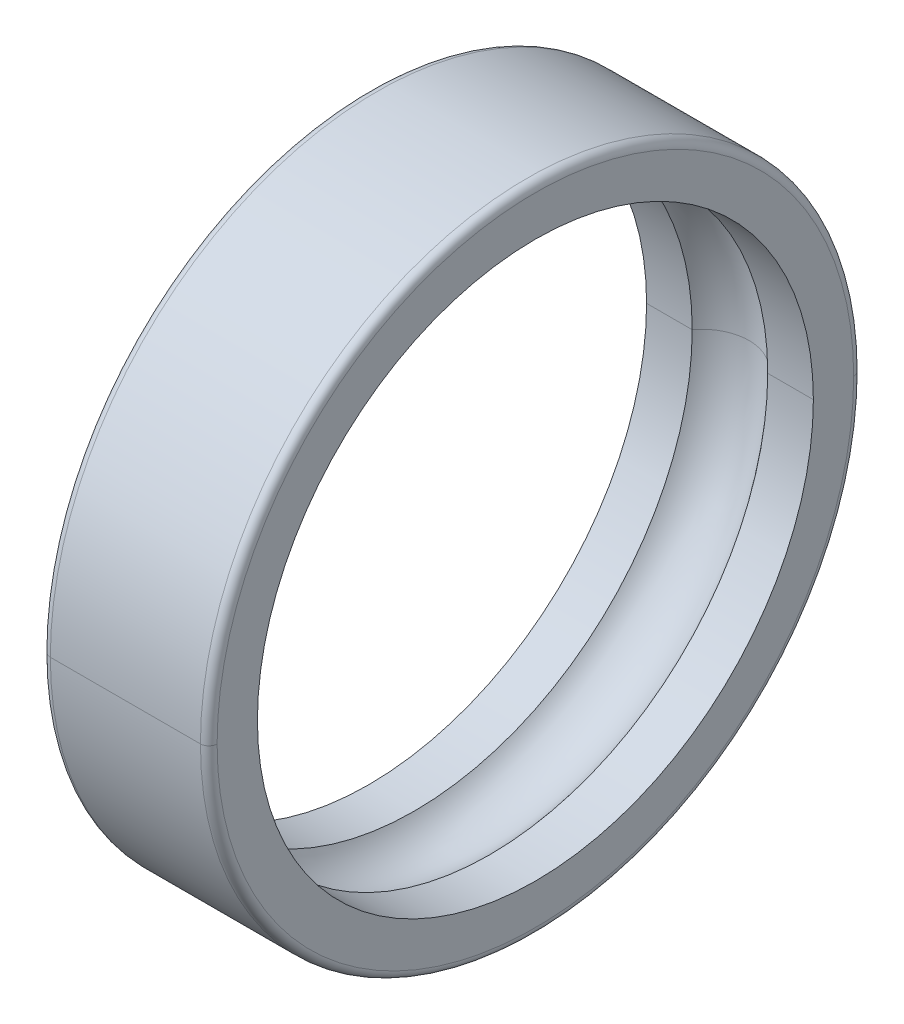
ISO-10303-21;
HEADER;
FILE_DESCRIPTION(('STEP AP214'),'2;1');
FILE_NAME('part.step','',(''),(''),'','','');
FILE_SCHEMA(('AUTOMOTIVE_DESIGN { 1 0 10303 214 1 1 1 1 }'));
ENDSEC;
DATA;
#1=APPLICATION_CONTEXT('core data for automotive mechanical design processes');
#2=APPLICATION_PROTOCOL_DEFINITION('international standard','automotive_design',2000,#1);
#3=PRODUCT_CONTEXT('',#1,'mechanical');
#4=PRODUCT('Part','Part','',(#3));
#5=PRODUCT_RELATED_PRODUCT_CATEGORY('part','',(#4));
#6=PRODUCT_DEFINITION_FORMATION('','',#4);
#7=PRODUCT_DEFINITION_CONTEXT('part definition',#1,'design');
#8=PRODUCT_DEFINITION('design','',#6,#7);
#9=PRODUCT_DEFINITION_SHAPE('','',#8);
#10=(LENGTH_UNIT() NAMED_UNIT(*) SI_UNIT(.MILLI.,.METRE.));
#11=(NAMED_UNIT(*) PLANE_ANGLE_UNIT() SI_UNIT($,.RADIAN.));
#12=(NAMED_UNIT(*) SI_UNIT($,.STERADIAN.) SOLID_ANGLE_UNIT());
#13=UNCERTAINTY_MEASURE_WITH_UNIT(LENGTH_MEASURE(1.E-05),#10,'distance_accuracy_value','');
#14=(GEOMETRIC_REPRESENTATION_CONTEXT(3) GLOBAL_UNCERTAINTY_ASSIGNED_CONTEXT((#13)) GLOBAL_UNIT_ASSIGNED_CONTEXT((#10,
#11,#12)) REPRESENTATION_CONTEXT('',''));
#15=CARTESIAN_POINT('',(0.,0.,0.));
#16=DIRECTION('',(0.,0.,1.));
#17=DIRECTION('',(1.,0.,0.));
#18=AXIS2_PLACEMENT_3D('',#15,#16,#17);
#19=CARTESIAN_POINT('',(0.599999999999872,0.,0.));
#20=DIRECTION('',(1.,0.,0.));
#21=DIRECTION('',(0.,1.,0.));
#22=AXIS2_PLACEMENT_3D('',#19,#20,#21);
#23=TOROIDAL_SURFACE('',#22,22.9,0.6);
#24=CARTESIAN_POINT('',(0.,0.,0.));
#25=DIRECTION('',(1.,0.,0.));
#26=DIRECTION('',(0.,0.,-1.));
#27=AXIS2_PLACEMENT_3D('',#24,#25,#26);
#28=CIRCLE('',#27,22.9);
#29=CARTESIAN_POINT('',(-1.28008714739281E-13,0.,22.9));
#30=VERTEX_POINT('',#29);
#31=CARTESIAN_POINT('',(0.,0.,-22.9));
#32=VERTEX_POINT('',#31);
#33=EDGE_CURVE('E11',#30,#32,#28,.T.);
#34=ORIENTED_EDGE('',*,*,#33,.T.);
#35=CARTESIAN_POINT('',(-1.2793585635329E-13,0.,-22.9));
#36=CARTESIAN_POINT('',(-2.08253392896423E-07,-1.04871103612339E-13,-22.9098174869565));
#37=CARTESIAN_POINT('',(0.000240949724780424,-1.07005765109073E-13,-22.9196349561928));
#38=CARTESIAN_POINT('',(0.00120450282875663,0.,-22.9392462530001));
#39=CARTESIAN_POINT('',(0.00192689795455952,0.,-22.9490400805713));
#40=CARTESIAN_POINT('',(0.00385143003854783,0.,-22.9685804878242));
#41=CARTESIAN_POINT('',(0.00505356699673323,0.,-22.9783270675058));
#42=CARTESIAN_POINT('',(0.00793462104527335,0.,-22.9977495018406));
#43=CARTESIAN_POINT('',(0.00961353813562813,0.,-23.0074253564937));
#44=CARTESIAN_POINT('',(0.0134441253802384,0.,-23.0266830299257));
#45=CARTESIAN_POINT('',(0.0155957955344938,0.,-23.0362648487046));
#46=CARTESIAN_POINT('',(0.0203667006317968,0.,-23.0553113671793));
#47=CARTESIAN_POINT('',(0.0229859355748446,0.,-23.0647760668749));
#48=CARTESIAN_POINT('',(0.0286856615462472,0.,-23.0835655458304));
#49=CARTESIAN_POINT('',(0.031766152574602,0.,-23.0928903250902));
#50=CARTESIAN_POINT('',(0.0383809692055159,0.,-23.1113774989805));
#51=CARTESIAN_POINT('',(0.0419152948080751,0.,-23.120539893611));
#52=CARTESIAN_POINT('',(0.0494292661781235,0.,-23.1386802252271));
#53=CARTESIAN_POINT('',(0.0534089119456127,0.,-23.1476581622127));
#54=CARTESIAN_POINT('',(0.0618039363059969,-1.08830991831159E-13,-23.1654079499036));
#55=CARTESIAN_POINT('',(0.066219314898892,-1.08649769215995E-13,-23.1741798006089));
#56=CARTESIAN_POINT('',(0.0754751678828246,0.,-23.1914962835823));
#57=CARTESIAN_POINT('',(0.0803156422738622,0.,-23.2000409158503));
#58=CARTESIAN_POINT('',(0.0904100257255531,0.,-23.2168823771816));
#59=CARTESIAN_POINT('',(0.0956639347862065,0.,-23.2251792062448));
#60=CARTESIAN_POINT('',(0.106572530450481,0.,-23.2415050733787));
#61=CARTESIAN_POINT('',(0.112227217054102,0.,-23.2495341114492));
#62=CARTESIAN_POINT('',(0.123923745168866,-1.07922777418776E-13,-23.2653050539417));
#63=CARTESIAN_POINT('',(0.129965586680009,-1.0497668290852E-13,-23.2730469583636));
#64=CARTESIAN_POINT('',(0.142421869284448,-1.02862445046799E-13,-23.2882249826328));
#65=CARTESIAN_POINT('',(0.148836310377744,-1.03694301695334E-13,-23.2956611024801));
#66=CARTESIAN_POINT('',(0.162022339196047,-1.04343905372629E-13,-23.3102096433363));
#67=CARTESIAN_POINT('',(0.168793926921053,-1.04161652401389E-13,-23.317322064345));
#68=CARTESIAN_POINT('',(0.18267793565483,-1.04066967743859E-13,-23.3312060730788));
#69=CARTESIAN_POINT('',(0.1897903566636,-1.04154536057569E-13,-23.3379776608038));
#70=CARTESIAN_POINT('',(0.204338897519718,-1.0425537240782E-13,-23.3511636896221));
#71=CARTESIAN_POINT('',(0.211775017367066,-1.0426864044436E-13,-23.3575781307154));
#72=CARTESIAN_POINT('',(0.2269530416363,-1.04312994844585E-13,-23.3700344133199));
#73=CARTESIAN_POINT('',(0.234694946058187,-1.0434408120827E-13,-23.376076254831));
#74=CARTESIAN_POINT('',(0.250465888550634,-1.04399305702687E-13,-23.3877727829458));
#75=CARTESIAN_POINT('',(0.258494926621194,-1.04423443833418E-13,-23.3934274695494));
#76=CARTESIAN_POINT('',(0.274820793755023,-1.0447132982418E-13,-23.4043360652137));
#77=CARTESIAN_POINT('',(0.283117622818291,-1.04495077684211E-13,-23.4095899742743));
#78=CARTESIAN_POINT('',(0.299959084149582,-1.04540353140728E-13,-23.419684357726));
#79=CARTESIAN_POINT('',(0.308503716417606,-1.04561880737216E-13,-23.424524832117));
#80=CARTESIAN_POINT('',(0.325820199390937,-1.04603138820325E-13,-23.433780685101));
#81=CARTESIAN_POINT('',(0.334592050096245,-1.04622869306947E-13,-23.4381960636939));
#82=CARTESIAN_POINT('',(0.352341837787155,-1.0466035835785E-13,-23.4465910880543));
#83=CARTESIAN_POINT('',(0.361319774772757,-1.04678116922131E-13,-23.4505707338217));
#84=CARTESIAN_POINT('',(0.379460106388875,-1.04711653450891E-13,-23.4580847051918));
#85=CARTESIAN_POINT('',(0.38862250101939,-1.04727431415369E-13,-23.4616190307944));
#86=CARTESIAN_POINT('',(0.407109674909685,-1.04756959596133E-13,-23.4682338474253));
#87=CARTESIAN_POINT('',(0.416434454169464,-1.04770709812419E-13,-23.4713143384536));
#88=CARTESIAN_POINT('',(0.43522393312492,-1.0479615181841E-13,-23.477014064425));
#89=CARTESIAN_POINT('',(0.444688632820596,-1.04807843608116E-13,-23.4796332993681));
#90=CARTESIAN_POINT('',(0.463735151295226,-1.04829139943943E-13,-23.4844042044654));
#91=CARTESIAN_POINT('',(0.47331697007418,-1.04838744490065E-13,-23.4865558746196));
#92=CARTESIAN_POINT('',(0.492574643506205,-1.04855843355276E-13,-23.4903864618642));
#93=CARTESIAN_POINT('',(0.502250498159276,-1.04863337674366E-13,-23.4920653789546));
#94=CARTESIAN_POINT('',(0.521672932494028,-1.04876198062521E-13,-23.4949464330031));
#95=CARTESIAN_POINT('',(0.531419512175709,-1.04881564131585E-13,-23.4961485699613));
#96=CARTESIAN_POINT('',(0.550959919428557,-1.04890154811704E-13,-23.4980731020453));
#97=CARTESIAN_POINT('',(0.560753746999724,-1.04893379422759E-13,-23.4987954971711));
#98=CARTESIAN_POINT('',(0.580365043807113,-1.04897680509627E-13,-23.4997590502751));
#99=CARTESIAN_POINT('',(0.590182513043335,-1.04898756985441E-13,-23.5000002082533));
#100=CARTESIAN_POINT('',(0.599999999999869,-1.04898756055019E-13,-23.5));
#101=B_SPLINE_CURVE_WITH_KNOTS('',3,(#35,#36,#37,#38,#39,#40,#41,#42,#43,#44,#45,#46,#47,#48,
#49,#50,#51,#52,#53,#54,#55,#56,#57,#58,#59,#60,#61,#62,#63,#64,#65,#66,#67,#68,#69,#70,#71,#72,
#73,#74,#75,#76,#77,#78,#79,#80,#81,#82,#83,#84,#85,#86,#87,#88,#89,#90,#91,#92,#93,#94,#95,#96,
#97,#98,#99,#100),.UNSPECIFIED.,.F.,.F.,(4,2,2,2,2,2,2,2,2,2,2,2,2,2,2,2,2,2,2,2,2,2,2,2,2,2,2,
2,2,2,2,2,4),(0.,0.0294494742274953,0.0588989484549908,0.0883484226824848,0.117797896909981,
0.147247371137474,0.176696845364971,0.206146319592464,0.235595793819959,0.265045268047455,
0.294494742274947,0.323944216502443,0.353393690729938,0.382843164957434,0.412292639184928,
0.441742113412421,0.471191587639916,0.500641061867412,0.530090536094907,0.559540010322401,
0.588989484549896,0.618438958777391,0.647888433004885,0.67733790723238,0.706787381459875,
0.736236855687369,0.765686329914864,0.795135804142359,0.824585278369854,0.854034752597349,
0.883484226824843,0.912933701052338,0.942383175279832),.UNSPECIFIED.);
#102=CARTESIAN_POINT('',(0.600000000000002,0.,-23.5));
#103=VERTEX_POINT('',#102);
#104=EDGE_CURVE('E25',#32,#103,#101,.T.);
#105=ORIENTED_EDGE('',*,*,#104,.T.);
#106=CARTESIAN_POINT('',(0.600000000000002,0.,0.));
#107=DIRECTION('',(1.,0.,0.));
#108=DIRECTION('',(0.,0.,-1.));
#109=AXIS2_PLACEMENT_3D('',#106,#107,#108);
#110=CIRCLE('',#109,23.5);
#111=CARTESIAN_POINT('',(0.599999999999872,0.,23.5));
#112=VERTEX_POINT('',#111);
#113=EDGE_CURVE('E283',#112,#103,#110,.T.);
#114=ORIENTED_EDGE('',*,*,#113,.F.);
#115=CARTESIAN_POINT('',(-1.2793585635329E-13,0.,22.9));
#116=CARTESIAN_POINT('',(-2.08253392937677E-07,0.,22.9098174869565));
#117=CARTESIAN_POINT('',(0.000240949724780423,0.,22.9196349561928));
#118=CARTESIAN_POINT('',(0.00120450282875669,0.,22.9392462530001));
#119=CARTESIAN_POINT('',(0.00192689795455966,0.,22.9490400805713));
#120=CARTESIAN_POINT('',(0.00385143003854791,0.,22.9685804878242));
#121=CARTESIAN_POINT('',(0.00505356699673318,0.,22.9783270675058));
#122=CARTESIAN_POINT('',(0.0079346210452734,0.,22.9977495018406));
#123=CARTESIAN_POINT('',(0.0096135381356284,0.,23.0074253564937));
#124=CARTESIAN_POINT('',(0.0134441253802385,0.,23.0266830299257));
#125=CARTESIAN_POINT('',(0.0155957955344936,0.,23.0362648487046));
#126=CARTESIAN_POINT('',(0.0203667006317968,0.,23.0553113671793));
#127=CARTESIAN_POINT('',(0.0229859355748449,0.,23.0647760668749));
#128=CARTESIAN_POINT('',(0.0286856615462476,0.,23.0835655458304));
#129=CARTESIAN_POINT('',(0.0317661525746023,0.,23.0928903250902));
#130=CARTESIAN_POINT('',(0.0383809692055161,0.,23.1113774989805));
#131=CARTESIAN_POINT('',(0.0419152948080752,0.,23.120539893611));
#132=CARTESIAN_POINT('',(0.0494292661781238,0.,23.1386802252271));
#133=CARTESIAN_POINT('',(0.0534089119456133,0.,23.1476581622127));
#134=CARTESIAN_POINT('',(0.0618039363059972,0.,23.1654079499036));
#135=CARTESIAN_POINT('',(0.0662193148988918,0.,23.1741798006089));
#136=CARTESIAN_POINT('',(0.0754751678828244,0.,23.1914962835823));
#137=CARTESIAN_POINT('',(0.0803156422738626,0.,23.2000409158503));
#138=CARTESIAN_POINT('',(0.0904100257255537,0.,23.2168823771816));
#139=CARTESIAN_POINT('',(0.0956639347862069,0.,23.2251792062448));
#140=CARTESIAN_POINT('',(0.106572530450481,0.,23.2415050733787));
#141=CARTESIAN_POINT('',(0.112227217054102,0.,23.2495341114492));
#142=CARTESIAN_POINT('',(0.123923745168866,0.,23.2653050539417));
#143=CARTESIAN_POINT('',(0.129965586680009,0.,23.2730469583636));
#144=CARTESIAN_POINT('',(0.142421869284448,0.,23.2882249826328));
#145=CARTESIAN_POINT('',(0.148836310377744,0.,23.2956611024801));
#146=CARTESIAN_POINT('',(0.162022339196047,0.,23.3102096433363));
#147=CARTESIAN_POINT('',(0.168793926921054,0.,23.317322064345));
#148=CARTESIAN_POINT('',(0.182677935654831,0.,23.3312060730788));
#149=CARTESIAN_POINT('',(0.189790356663601,0.,23.3379776608038));
#150=CARTESIAN_POINT('',(0.204338897519718,0.,23.3511636896221));
#151=CARTESIAN_POINT('',(0.211775017367066,0.,23.3575781307154));
#152=CARTESIAN_POINT('',(0.2269530416363,0.,23.3700344133199));
#153=CARTESIAN_POINT('',(0.234694946058187,0.,23.376076254831));
#154=CARTESIAN_POINT('',(0.250465888550634,0.,23.3877727829458));
#155=CARTESIAN_POINT('',(0.258494926621195,0.,23.3934274695494));
#156=CARTESIAN_POINT('',(0.274820793755023,0.,23.4043360652137));
#157=CARTESIAN_POINT('',(0.283117622818291,0.,23.4095899742743));
#158=CARTESIAN_POINT('',(0.299959084149583,0.,23.419684357726));
#159=CARTESIAN_POINT('',(0.308503716417606,0.,23.424524832117));
#160=CARTESIAN_POINT('',(0.325820199390938,0.,23.433780685101));
#161=CARTESIAN_POINT('',(0.334592050096246,0.,23.4381960636939));
#162=CARTESIAN_POINT('',(0.352341837787156,0.,23.4465910880543));
#163=CARTESIAN_POINT('',(0.361319774772758,0.,23.4505707338217));
#164=CARTESIAN_POINT('',(0.379460106388875,0.,23.4580847051918));
#165=CARTESIAN_POINT('',(0.388622501019391,0.,23.4616190307944));
#166=CARTESIAN_POINT('',(0.407109674909685,0.,23.4682338474253));
#167=CARTESIAN_POINT('',(0.416434454169465,0.,23.4713143384536));
#168=CARTESIAN_POINT('',(0.43522393312492,0.,23.477014064425));
#169=CARTESIAN_POINT('',(0.444688632820597,0.,23.4796332993681));
#170=CARTESIAN_POINT('',(0.463735151295227,0.,23.4844042044654));
#171=CARTESIAN_POINT('',(0.473316970074181,0.,23.4865558746196));
#172=CARTESIAN_POINT('',(0.492574643506206,0.,23.4903864618642));
#173=CARTESIAN_POINT('',(0.502250498159277,0.,23.4920653789546));
#174=CARTESIAN_POINT('',(0.521672932494029,0.,23.4949464330031));
#175=CARTESIAN_POINT('',(0.53141951217571,0.,23.4961485699613));
#176=CARTESIAN_POINT('',(0.550959919428557,0.,23.4980731020453));
#177=CARTESIAN_POINT('',(0.560753746999725,0.,23.4987954971711));
#178=CARTESIAN_POINT('',(0.580365043807114,0.,23.4997590502751));
#179=CARTESIAN_POINT('',(0.590182513043336,0.,23.5000002082533));
#180=CARTESIAN_POINT('',(0.59999999999987,0.,23.5));
#181=B_SPLINE_CURVE_WITH_KNOTS('',3,(#115,#116,#117,#118,#119,#120,#121,#122,#123,#124,#125,
#126,#127,#128,#129,#130,#131,#132,#133,#134,#135,#136,#137,#138,#139,#140,#141,#142,#143,#144,
#145,#146,#147,#148,#149,#150,#151,#152,#153,#154,#155,#156,#157,#158,#159,#160,#161,#162,#163,
#164,#165,#166,#167,#168,#169,#170,#171,#172,#173,#174,#175,#176,#177,#178,#179,#180),
.UNSPECIFIED.,.F.,.F.,(4,2,2,2,2,2,2,2,2,2,2,2,2,2,2,2,2,2,2,2,2,2,2,2,2,2,2,2,2,2,2,2,4),(0.,
0.0294494742274919,0.0588989484549873,0.0883484226824813,0.117797896909978,0.147247371137474,
0.176696845364968,0.206146319592461,0.235595793819955,0.265045268047451,0.294494742274947,
0.32394421650244,0.353393690729935,0.38284316495743,0.412292639184925,0.441742113412418,
0.471191587639913,0.500641061867409,0.530090536094904,0.559540010322398,0.588989484549893,
0.618438958777388,0.647888433004881,0.677337907232377,0.706787381459871,0.736236855687366,
0.765686329914861,0.795135804142356,0.824585278369851,0.854034752597346,0.88348422682484,
0.912933701052335,0.942383175279829),.UNSPECIFIED.);
#182=EDGE_CURVE('E271',#30,#112,#181,.T.);
#183=ORIENTED_EDGE('',*,*,#182,.F.);
#184=EDGE_LOOP('',(#34,#105,#114,#183));
#185=FACE_BOUND('',#184,.T.);
#186=ADVANCED_FACE('F16',(#185),#23,.T.);
#187=CARTESIAN_POINT('',(0.599999999999872,0.,0.));
#188=DIRECTION('',(1.,0.,0.));
#189=DIRECTION('',(0.,-1.,0.));
#190=AXIS2_PLACEMENT_3D('',#187,#188,#189);
#191=TOROIDAL_SURFACE('',#190,22.9,0.6);
#192=CARTESIAN_POINT('',(0.600000000000002,0.,0.));
#193=DIRECTION('',(1.,0.,0.));
#194=DIRECTION('',(0.,0.,-1.));
#195=AXIS2_PLACEMENT_3D('',#192,#193,#194);
#196=CIRCLE('',#195,23.5);
#197=EDGE_CURVE('E107',#103,#112,#196,.T.);
#198=ORIENTED_EDGE('',*,*,#197,.F.);
#199=ORIENTED_EDGE('',*,*,#104,.F.);
#200=CARTESIAN_POINT('',(0.,0.,0.));
#201=DIRECTION('',(1.,0.,0.));
#202=DIRECTION('',(0.,0.,-1.));
#203=AXIS2_PLACEMENT_3D('',#200,#201,#202);
#204=CIRCLE('',#203,22.9);
#205=EDGE_CURVE('E235',#32,#30,#204,.T.);
#206=ORIENTED_EDGE('',*,*,#205,.T.);
#207=ORIENTED_EDGE('',*,*,#182,.T.);
#208=EDGE_LOOP('',(#198,#199,#206,#207));
#209=FACE_BOUND('',#208,.T.);
#210=ADVANCED_FACE('F243',(#209),#191,.T.);
#211=CARTESIAN_POINT('',(0.,22.9,0.));
#212=DIRECTION('',(-1.,0.,0.));
#213=DIRECTION('',(0.,0.,1.));
#214=AXIS2_PLACEMENT_3D('',#211,#212,#213);
#215=PLANE('',#214);
#216=CARTESIAN_POINT('',(0.,0.,0.));
#217=DIRECTION('',(1.,0.,0.));
#218=DIRECTION('',(0.,0.,-1.));
#219=AXIS2_PLACEMENT_3D('',#216,#217,#218);
#220=CIRCLE('',#219,20.);
#221=CARTESIAN_POINT('',(0.,0.,-20.));
#222=VERTEX_POINT('',#221);
#223=CARTESIAN_POINT('',(0.,0.,20.));
#224=VERTEX_POINT('',#223);
#225=EDGE_CURVE('E231',#222,#224,#220,.T.);
#226=ORIENTED_EDGE('',*,*,#225,.T.);
#227=CARTESIAN_POINT('',(0.,0.,0.));
#228=DIRECTION('',(1.,0.,0.));
#229=DIRECTION('',(0.,0.,-1.));
#230=AXIS2_PLACEMENT_3D('',#227,#228,#229);
#231=CIRCLE('',#230,20.);
#232=EDGE_CURVE('E227',#224,#222,#231,.T.);
#233=ORIENTED_EDGE('',*,*,#232,.T.);
#234=EDGE_LOOP('',(#226,#233));
#235=FACE_BOUND('',#234,.T.);
#236=ORIENTED_EDGE('',*,*,#205,.F.);
#237=ORIENTED_EDGE('',*,*,#33,.F.);
#238=EDGE_LOOP('',(#236,#237));
#239=FACE_BOUND('',#238,.T.);
#240=ADVANCED_FACE('F252',(#235,#239),#215,.T.);
#241=CARTESIAN_POINT('',(12.,0.,0.));
#242=DIRECTION('',(-1.,0.,0.));
#243=DIRECTION('',(0.,1.,0.));
#244=AXIS2_PLACEMENT_3D('',#241,#242,#243);
#245=CYLINDRICAL_SURFACE('',#244,20.);
#246=ORIENTED_EDGE('',*,*,#232,.F.);
#247=DIRECTION('',(-1.,0.,0.));
#248=VECTOR('',#247,1.);
#249=CARTESIAN_POINT('',(3.2832920197415,0.,20.));
#250=LINE('',#249,#248);
#251=CARTESIAN_POINT('',(3.2832920197415,0.,20.));
#252=VERTEX_POINT('',#251);
#253=EDGE_CURVE('E222',#252,#224,#250,.T.);
#254=ORIENTED_EDGE('',*,*,#253,.F.);
#255=CARTESIAN_POINT('',(3.2832920197415,0.,0.));
#256=DIRECTION('',(1.,0.,0.));
#257=DIRECTION('',(0.,0.,-1.));
#258=AXIS2_PLACEMENT_3D('',#255,#256,#257);
#259=CIRCLE('',#258,20.);
#260=CARTESIAN_POINT('',(3.2832920197415,0.,-20.));
#261=VERTEX_POINT('',#260);
#262=EDGE_CURVE('E218',#252,#261,#259,.T.);
#263=ORIENTED_EDGE('',*,*,#262,.T.);
#264=DIRECTION('',(-1.,0.,0.));
#265=VECTOR('',#264,1.);
#266=CARTESIAN_POINT('',(3.2832920197415,0.,-20.));
#267=LINE('',#266,#265);
#268=EDGE_CURVE('E213',#261,#222,#267,.T.);
#269=ORIENTED_EDGE('',*,*,#268,.T.);
#270=EDGE_LOOP('',(#246,#254,#263,#269));
#271=FACE_BOUND('',#270,.T.);
#272=ADVANCED_FACE('F296',(#271),#245,.F.);
#273=CARTESIAN_POINT('',(12.,0.,0.));
#274=DIRECTION('',(-1.,0.,0.));
#275=DIRECTION('',(0.,-1.,0.));
#276=AXIS2_PLACEMENT_3D('',#273,#274,#275);
#277=CYLINDRICAL_SURFACE('',#276,20.);
#278=CARTESIAN_POINT('',(3.2832920197415,0.,0.));
#279=DIRECTION('',(1.,0.,0.));
#280=DIRECTION('',(0.,0.,-1.));
#281=AXIS2_PLACEMENT_3D('',#278,#279,#280);
#282=CIRCLE('',#281,20.);
#283=EDGE_CURVE('E208',#261,#252,#282,.T.);
#284=ORIENTED_EDGE('',*,*,#283,.T.);
#285=ORIENTED_EDGE('',*,*,#253,.T.);
#286=ORIENTED_EDGE('',*,*,#225,.F.);
#287=ORIENTED_EDGE('',*,*,#268,.F.);
#288=EDGE_LOOP('',(#284,#285,#286,#287));
#289=FACE_BOUND('',#288,.T.);
#290=ADVANCED_FACE('F302',(#289),#277,.F.);
#291=CARTESIAN_POINT('',(6.,0.,0.));
#292=DIRECTION('',(1.,0.,0.));
#293=DIRECTION('',(0.,-1.,0.));
#294=AXIS2_PLACEMENT_3D('',#291,#292,#293);
#295=TOROIDAL_SURFACE('',#294,18.,3.3735);
#296=CARTESIAN_POINT('',(8.7167079802585,0.,0.));
#297=DIRECTION('',(1.,0.,0.));
#298=DIRECTION('',(0.,0.,-1.));
#299=AXIS2_PLACEMENT_3D('',#296,#297,#298);
#300=CIRCLE('',#299,20.);
#301=CARTESIAN_POINT('',(8.7167079802585,0.,-20.));
#302=VERTEX_POINT('',#301);
#303=CARTESIAN_POINT('',(8.71670798025847,0.,20.));
#304=VERTEX_POINT('',#303);
#305=EDGE_CURVE('E206',#302,#304,#300,.T.);
#306=ORIENTED_EDGE('',*,*,#305,.T.);
#307=CARTESIAN_POINT('',(3.28329201974152,0.,20.));
#308=CARTESIAN_POINT('',(3.32229834341789,0.,20.052988380681));
#309=CARTESIAN_POINT('',(3.36285845263352,0.,20.1048325898836));
#310=CARTESIAN_POINT('',(3.44693942466518,0.,20.2060618562269));
#311=CARTESIAN_POINT('',(3.49046028748122,0.,20.2554469133676));
#312=CARTESIAN_POINT('',(3.58031594923559,0.,20.3515870664816));
#313=CARTESIAN_POINT('',(3.62665074817392,0.,20.3983421624549));
#314=CARTESIAN_POINT('',(3.72197511808807,0.,20.4890628410201));
#315=CARTESIAN_POINT('',(3.77096468906389,0.,20.5330284236119));
#316=CARTESIAN_POINT('',(3.8714310800441,0.,20.6180194665665));
#317=CARTESIAN_POINT('',(3.92290790004849,0.,20.6590449269293));
#318=CARTESIAN_POINT('',(4.02817255800911,0.,20.7380153416685));
#319=CARTESIAN_POINT('',(4.08196039596533,0.,20.7759602960449));
#320=CARTESIAN_POINT('',(4.19166300106162,0.,20.8486398153244));
#321=CARTESIAN_POINT('',(4.24757776820169,0.,20.8833743802274));
#322=CARTESIAN_POINT('',(4.36134284905332,0.,20.9495142369092));
#323=CARTESIAN_POINT('',(4.41919316276487,0.,20.980919528688));
#324=CARTESIAN_POINT('',(4.53663133309608,0.,21.0402933474691));
#325=CARTESIAN_POINT('',(4.59621918971573,0.,21.0682618744715));
#326=CARTESIAN_POINT('',(4.71692849410106,0.,21.1206664359083));
#327=CARTESIAN_POINT('',(4.77804994186674,0.,21.1451024703428));
#328=CARTESIAN_POINT('',(4.90161722802397,0.,21.1903584093025));
#329=CARTESIAN_POINT('',(4.96406306641551,0.,21.2111783138277));
#330=CARTESIAN_POINT('',(5.09006540023604,0.,21.2491307326269));
#331=CARTESIAN_POINT('',(5.15362189566504,0.,21.2662632469009));
#332=CARTESIAN_POINT('',(5.28162800854198,0.,21.2967822456822));
#333=CARTESIAN_POINT('',(5.34607762598992,0.,21.3101687301895));
#334=CARTESIAN_POINT('',(5.47564939098945,0.,21.3331498514746));
#335=CARTESIAN_POINT('',(5.54077153854102,0.,21.3427444882523));
#336=CARTESIAN_POINT('',(5.67146546996293,0.,21.3581090744835));
#337=CARTESIAN_POINT('',(5.73703725383326,0.,21.363879023937));
#338=CARTESIAN_POINT('',(5.86840602513572,0.,21.3715744866953));
#339=CARTESIAN_POINT('',(5.93420301256785,0.,21.3735));
#340=CARTESIAN_POINT('',(6.06579698743212,0.,21.3735));
#341=CARTESIAN_POINT('',(6.13159397486426,0.,21.3715744866953));
#342=CARTESIAN_POINT('',(6.26296274616672,0.,21.363879023937));
#343=CARTESIAN_POINT('',(6.32853453003705,0.,21.3581090744835));
#344=CARTESIAN_POINT('',(6.45922846145895,0.,21.3427444882523));
#345=CARTESIAN_POINT('',(6.52435060901053,0.,21.3331498514746));
#346=CARTESIAN_POINT('',(6.65392237401005,0.,21.3101687301895));
#347=CARTESIAN_POINT('',(6.718371991458,0.,21.2967822456822));
#348=CARTESIAN_POINT('',(6.84637810433494,0.,21.2662632469009));
#349=CARTESIAN_POINT('',(6.90993459976393,0.,21.2491307326269));
#350=CARTESIAN_POINT('',(7.03593693358447,0.,21.2111783138277));
#351=CARTESIAN_POINT('',(7.09838277197601,0.,21.1903584093025));
#352=CARTESIAN_POINT('',(7.22195005813324,0.,21.1451024703428));
#353=CARTESIAN_POINT('',(7.28307150589892,0.,21.1206664359084));
#354=CARTESIAN_POINT('',(7.40378081028425,0.,21.0682618744715));
#355=CARTESIAN_POINT('',(7.4633686669039,0.,21.0402933474691));
#356=CARTESIAN_POINT('',(7.58080683723511,0.,20.980919528688));
#357=CARTESIAN_POINT('',(7.63865715094667,0.,20.9495142369092));
#358=CARTESIAN_POINT('',(7.75242223179829,0.,20.8833743802274));
#359=CARTESIAN_POINT('',(7.80833699893836,0.,20.8486398153244));
#360=CARTESIAN_POINT('',(7.91803960403465,0.,20.7759602960449));
#361=CARTESIAN_POINT('',(7.97182744199087,0.,20.7380153416685));
#362=CARTESIAN_POINT('',(8.07709209995149,0.,20.6590449269293));
#363=CARTESIAN_POINT('',(8.12856891995588,0.,20.6180194665665));
#364=CARTESIAN_POINT('',(8.22903531093609,0.,20.533028423612));
#365=CARTESIAN_POINT('',(8.27802488191191,0.,20.4890628410201));
#366=CARTESIAN_POINT('',(8.37334925182606,0.,20.3983421624549));
#367=CARTESIAN_POINT('',(8.41968405076439,0.,20.3515870664816));
#368=CARTESIAN_POINT('',(8.50953971251876,0.,20.2554469133676));
#369=CARTESIAN_POINT('',(8.5530605753348,0.,20.2060618562269));
#370=CARTESIAN_POINT('',(8.63714154736647,0.,20.1048325898837));
#371=CARTESIAN_POINT('',(8.6777016565821,0.,20.052988380681));
#372=CARTESIAN_POINT('',(8.71670798025847,0.,20.));
#373=B_SPLINE_CURVE_WITH_KNOTS('',3,(#307,#308,#309,#310,#311,#312,#313,#314,#315,#316,#317,
#318,#319,#320,#321,#322,#323,#324,#325,#326,#327,#328,#329,#330,#331,#332,#333,#334,#335,#336,
#337,#338,#339,#340,#341,#342,#343,#344,#345,#346,#347,#348,#349,#350,#351,#352,#353,#354,#355,
#356,#357,#358,#359,#360,#361,#362,#363,#364,#365,#366,#367,#368,#369,#370,#371,#372),
.UNSPECIFIED.,.F.,.F.,(4,2,2,2,2,2,2,2,2,2,2,2,2,2,2,2,2,2,2,2,2,2,2,2,2,2,2,2,2,2,2,2,4),(0.,
0.197362817880836,0.394725635761668,0.592088453642504,0.789451271523336,0.986814089404172,
1.18417690728501,1.38153972516584,1.57890254304667,1.77626536092751,1.97362817880834,
2.17099099668918,2.36835381457001,2.56571663245084,2.76307945033168,2.96044226821251,
3.15780508609335,3.35516790397418,3.55253072185501,3.74989353973585,3.94725635761668,
4.14461917549751,4.34198199337835,4.53934481125918,4.73670762914002,4.93407044702085,
5.13143326490168,5.32879608278252,5.52615890066335,5.72352171854419,5.92088453642502,
6.11824735430586,6.31561017218669),.UNSPECIFIED.);
#374=EDGE_CURVE('E183',#252,#304,#373,.T.);
#375=ORIENTED_EDGE('',*,*,#374,.F.);
#376=ORIENTED_EDGE('',*,*,#283,.F.);
#377=CARTESIAN_POINT('',(3.28329201974152,0.,-20.));
#378=CARTESIAN_POINT('',(3.32229834341789,0.,-20.052988380681));
#379=CARTESIAN_POINT('',(3.36285845263352,0.,-20.1048325898836));
#380=CARTESIAN_POINT('',(3.44693942466519,0.,-20.2060618562269));
#381=CARTESIAN_POINT('',(3.49046028748123,0.,-20.2554469133676));
#382=CARTESIAN_POINT('',(3.5803159492356,0.,-20.3515870664816));
#383=CARTESIAN_POINT('',(3.62665074817393,0.,-20.3983421624549));
#384=CARTESIAN_POINT('',(3.72197511808808,0.,-20.4890628410201));
#385=CARTESIAN_POINT('',(3.77096468906389,0.,-20.5330284236119));
#386=CARTESIAN_POINT('',(3.8714310800441,0.,-20.6180194665665));
#387=CARTESIAN_POINT('',(3.9229079000485,0.,-20.6590449269293));
#388=CARTESIAN_POINT('',(4.02817255800911,0.,-20.7380153416685));
#389=CARTESIAN_POINT('',(4.08196039596534,0.,-20.7759602960449));
#390=CARTESIAN_POINT('',(4.19166300106163,0.,-20.8486398153244));
#391=CARTESIAN_POINT('',(4.2475777682017,0.,-20.8833743802274));
#392=CARTESIAN_POINT('',(4.36134284905332,0.,-20.9495142369092));
#393=CARTESIAN_POINT('',(4.41919316276488,0.,-20.980919528688));
#394=CARTESIAN_POINT('',(4.53663133309608,0.,-21.0402933474691));
#395=CARTESIAN_POINT('',(4.59621918971573,0.,-21.0682618744715));
#396=CARTESIAN_POINT('',(4.71692849410107,0.,-21.1206664359084));
#397=CARTESIAN_POINT('',(4.77804994186675,0.,-21.1451024703428));
#398=CARTESIAN_POINT('',(4.90161722802397,0.,-21.1903584093025));
#399=CARTESIAN_POINT('',(4.96406306641551,0.,-21.2111783138277));
#400=CARTESIAN_POINT('',(5.09006540023605,0.,-21.2491307326269));
#401=CARTESIAN_POINT('',(5.15362189566504,0.,-21.2662632469009));
#402=CARTESIAN_POINT('',(5.28162800854198,0.,-21.2967822456822));
#403=CARTESIAN_POINT('',(5.34607762598993,0.,-21.3101687301895));
#404=CARTESIAN_POINT('',(5.47564939098945,0.,-21.3331498514746));
#405=CARTESIAN_POINT('',(5.54077153854103,0.,-21.3427444882523));
#406=CARTESIAN_POINT('',(5.67146546996293,0.,-21.3581090744835));
#407=CARTESIAN_POINT('',(5.73703725383326,0.,-21.363879023937));
#408=CARTESIAN_POINT('',(5.86840602513572,0.,-21.3715744866953));
#409=CARTESIAN_POINT('',(5.93420301256786,0.,-21.3735));
#410=CARTESIAN_POINT('',(6.06579698743213,0.,-21.3735));
#411=CARTESIAN_POINT('',(6.13159397486426,0.,-21.3715744866953));
#412=CARTESIAN_POINT('',(6.26296274616672,0.,-21.363879023937));
#413=CARTESIAN_POINT('',(6.32853453003705,0.,-21.3581090744835));
#414=CARTESIAN_POINT('',(6.45922846145896,0.,-21.3427444882523));
#415=CARTESIAN_POINT('',(6.52435060901054,0.,-21.3331498514746));
#416=CARTESIAN_POINT('',(6.65392237401006,0.,-21.3101687301895));
#417=CARTESIAN_POINT('',(6.718371991458,0.,-21.2967822456822));
#418=CARTESIAN_POINT('',(6.84637810433494,0.,-21.2662632469009));
#419=CARTESIAN_POINT('',(6.90993459976394,0.,-21.2491307326269));
#420=CARTESIAN_POINT('',(7.03593693358448,0.,-21.2111783138277));
#421=CARTESIAN_POINT('',(7.09838277197602,0.,-21.1903584093025));
#422=CARTESIAN_POINT('',(7.22195005813324,0.,-21.1451024703428));
#423=CARTESIAN_POINT('',(7.28307150589892,0.,-21.1206664359084));
#424=CARTESIAN_POINT('',(7.40378081028425,0.,-21.0682618744715));
#425=CARTESIAN_POINT('',(7.46336866690391,0.,-21.0402933474691));
#426=CARTESIAN_POINT('',(7.58080683723511,0.,-20.980919528688));
#427=CARTESIAN_POINT('',(7.63865715094667,0.,-20.9495142369092));
#428=CARTESIAN_POINT('',(7.75242223179829,0.,-20.8833743802274));
#429=CARTESIAN_POINT('',(7.80833699893836,0.,-20.8486398153244));
#430=CARTESIAN_POINT('',(7.91803960403465,0.,-20.7759602960449));
#431=CARTESIAN_POINT('',(7.97182744199088,0.,-20.7380153416685));
#432=CARTESIAN_POINT('',(8.07709209995149,0.,-20.6590449269293));
#433=CARTESIAN_POINT('',(8.12856891995589,0.,-20.6180194665665));
#434=CARTESIAN_POINT('',(8.2290353109361,0.,-20.5330284236119));
#435=CARTESIAN_POINT('',(8.27802488191191,0.,-20.4890628410201));
#436=CARTESIAN_POINT('',(8.37334925182606,0.,-20.3983421624549));
#437=CARTESIAN_POINT('',(8.41968405076439,0.,-20.3515870664816));
#438=CARTESIAN_POINT('',(8.50953971251876,0.,-20.2554469133676));
#439=CARTESIAN_POINT('',(8.5530605753348,0.,-20.2060618562269));
#440=CARTESIAN_POINT('',(8.63714154736647,0.,-20.1048325898837));
#441=CARTESIAN_POINT('',(8.6777016565821,0.,-20.052988380681));
#442=CARTESIAN_POINT('',(8.71670798025847,0.,-20.));
#443=B_SPLINE_CURVE_WITH_KNOTS('',3,(#377,#378,#379,#380,#381,#382,#383,#384,#385,#386,#387,
#388,#389,#390,#391,#392,#393,#394,#395,#396,#397,#398,#399,#400,#401,#402,#403,#404,#405,#406,
#407,#408,#409,#410,#411,#412,#413,#414,#415,#416,#417,#418,#419,#420,#421,#422,#423,#424,#425,
#426,#427,#428,#429,#430,#431,#432,#433,#434,#435,#436,#437,#438,#439,#440,#441,#442),
.UNSPECIFIED.,.F.,.F.,(4,2,2,2,2,2,2,2,2,2,2,2,2,2,2,2,2,2,2,2,2,2,2,2,2,2,2,2,2,2,2,2,4),(0.,
0.197362817880833,0.394725635761668,0.592088453642502,0.789451271523335,0.986814089404171,
1.184176907285,1.38153972516584,1.57890254304667,1.77626536092751,1.97362817880834,
2.17099099668917,2.36835381457001,2.56571663245084,2.76307945033167,2.96044226821251,
3.15780508609334,3.35516790397418,3.55253072185501,3.74989353973584,3.94725635761668,
4.14461917549751,4.34198199337835,4.53934481125918,4.73670762914001,4.93407044702085,
5.13143326490168,5.32879608278251,5.52615890066335,5.72352171854418,5.92088453642502,
6.11824735430585,6.31561017218668),.UNSPECIFIED.);
#444=EDGE_CURVE('E196',#261,#302,#443,.T.);
#445=ORIENTED_EDGE('',*,*,#444,.T.);
#446=EDGE_LOOP('',(#306,#375,#376,#445));
#447=FACE_BOUND('',#446,.T.);
#448=ADVANCED_FACE('F161',(#447),#295,.F.);
#449=CARTESIAN_POINT('',(6.,0.,0.));
#450=DIRECTION('',(1.,0.,0.));
#451=DIRECTION('',(0.,1.,0.));
#452=AXIS2_PLACEMENT_3D('',#449,#450,#451);
#453=TOROIDAL_SURFACE('',#452,18.,3.3735);
#454=ORIENTED_EDGE('',*,*,#262,.F.);
#455=ORIENTED_EDGE('',*,*,#374,.T.);
#456=CARTESIAN_POINT('',(8.7167079802585,0.,0.));
#457=DIRECTION('',(1.,0.,0.));
#458=DIRECTION('',(0.,0.,-1.));
#459=AXIS2_PLACEMENT_3D('',#456,#457,#458);
#460=CIRCLE('',#459,20.);
#461=EDGE_CURVE('E141',#304,#302,#460,.T.);
#462=ORIENTED_EDGE('',*,*,#461,.T.);
#463=ORIENTED_EDGE('',*,*,#444,.F.);
#464=EDGE_LOOP('',(#454,#455,#462,#463));
#465=FACE_BOUND('',#464,.T.);
#466=ADVANCED_FACE('F150',(#465),#453,.F.);
#467=CARTESIAN_POINT('',(12.,0.,0.));
#468=DIRECTION('',(-1.,0.,0.));
#469=DIRECTION('',(0.,1.,0.));
#470=AXIS2_PLACEMENT_3D('',#467,#468,#469);
#471=CYLINDRICAL_SURFACE('',#470,20.);
#472=ORIENTED_EDGE('',*,*,#461,.F.);
#473=DIRECTION('',(-1.,0.,0.));
#474=VECTOR('',#473,1.);
#475=CARTESIAN_POINT('',(12.,0.,20.));
#476=LINE('',#475,#474);
#477=CARTESIAN_POINT('',(12.,0.,20.));
#478=VERTEX_POINT('',#477);
#479=EDGE_CURVE('E136',#478,#304,#476,.T.);
#480=ORIENTED_EDGE('',*,*,#479,.F.);
#481=CARTESIAN_POINT('',(12.,0.,0.));
#482=DIRECTION('',(1.,0.,0.));
#483=DIRECTION('',(0.,0.,-1.));
#484=AXIS2_PLACEMENT_3D('',#481,#482,#483);
#485=CIRCLE('',#484,20.);
#486=CARTESIAN_POINT('',(12.,0.,-20.));
#487=VERTEX_POINT('',#486);
#488=EDGE_CURVE('E132',#478,#487,#485,.T.);
#489=ORIENTED_EDGE('',*,*,#488,.T.);
#490=DIRECTION('',(-1.,0.,0.));
#491=VECTOR('',#490,1.);
#492=CARTESIAN_POINT('',(12.,0.,-20.));
#493=LINE('',#492,#491);
#494=EDGE_CURVE('E127',#487,#302,#493,.T.);
#495=ORIENTED_EDGE('',*,*,#494,.T.);
#496=EDGE_LOOP('',(#472,#480,#489,#495));
#497=FACE_BOUND('',#496,.T.);
#498=ADVANCED_FACE('F160',(#497),#471,.F.);
#499=CARTESIAN_POINT('',(12.,0.,0.));
#500=DIRECTION('',(-1.,0.,0.));
#501=DIRECTION('',(0.,-1.,0.));
#502=AXIS2_PLACEMENT_3D('',#499,#500,#501);
#503=CYLINDRICAL_SURFACE('',#502,20.);
#504=CARTESIAN_POINT('',(12.,0.,0.));
#505=DIRECTION('',(1.,0.,0.));
#506=DIRECTION('',(0.,0.,-1.));
#507=AXIS2_PLACEMENT_3D('',#504,#505,#506);
#508=CIRCLE('',#507,20.);
#509=EDGE_CURVE('E122',#487,#478,#508,.T.);
#510=ORIENTED_EDGE('',*,*,#509,.T.);
#511=ORIENTED_EDGE('',*,*,#479,.T.);
#512=ORIENTED_EDGE('',*,*,#305,.F.);
#513=ORIENTED_EDGE('',*,*,#494,.F.);
#514=EDGE_LOOP('',(#510,#511,#512,#513));
#515=FACE_BOUND('',#514,.T.);
#516=ADVANCED_FACE('F356',(#515),#503,.F.);
#517=CARTESIAN_POINT('',(12.,20.,0.));
#518=DIRECTION('',(1.,0.,0.));
#519=DIRECTION('',(0.,0.,-1.));
#520=AXIS2_PLACEMENT_3D('',#517,#518,#519);
#521=PLANE('',#520);
#522=CARTESIAN_POINT('',(12.,0.,0.));
#523=DIRECTION('',(1.,0.,0.));
#524=DIRECTION('',(0.,0.,-1.));
#525=AXIS2_PLACEMENT_3D('',#522,#523,#524);
#526=CIRCLE('',#525,22.9);
#527=CARTESIAN_POINT('',(12.,0.,-22.9));
#528=VERTEX_POINT('',#527);
#529=CARTESIAN_POINT('',(12.0000000000003,0.,22.9));
#530=VERTEX_POINT('',#529);
#531=EDGE_CURVE('E113',#528,#530,#526,.T.);
#532=ORIENTED_EDGE('',*,*,#531,.T.);
#533=CARTESIAN_POINT('',(12.,0.,0.));
#534=DIRECTION('',(1.,0.,0.));
#535=DIRECTION('',(0.,0.,-1.));
#536=AXIS2_PLACEMENT_3D('',#533,#534,#535);
#537=CIRCLE('',#536,22.9);
#538=EDGE_CURVE('E86',#530,#528,#537,.T.);
#539=ORIENTED_EDGE('',*,*,#538,.T.);
#540=EDGE_LOOP('',(#532,#539));
#541=FACE_BOUND('',#540,.T.);
#542=ORIENTED_EDGE('',*,*,#509,.F.);
#543=ORIENTED_EDGE('',*,*,#488,.F.);
#544=EDGE_LOOP('',(#542,#543));
#545=FACE_BOUND('',#544,.T.);
#546=ADVANCED_FACE('F365',(#541,#545),#521,.T.);
#547=CARTESIAN_POINT('',(11.4000000000003,0.,0.));
#548=DIRECTION('',(1.,0.,0.));
#549=DIRECTION('',(0.,1.,0.));
#550=AXIS2_PLACEMENT_3D('',#547,#548,#549);
#551=TOROIDAL_SURFACE('',#550,22.9,0.6);
#552=CARTESIAN_POINT('',(11.4,0.,0.));
#553=DIRECTION('',(1.,0.,0.));
#554=DIRECTION('',(0.,0.,-1.));
#555=AXIS2_PLACEMENT_3D('',#552,#553,#554);
#556=CIRCLE('',#555,23.5);
#557=CARTESIAN_POINT('',(11.4000000000003,0.,23.5));
#558=VERTEX_POINT('',#557);
#559=CARTESIAN_POINT('',(11.4,0.,-23.5));
#560=VERTEX_POINT('',#559);
#561=EDGE_CURVE('E84',#558,#560,#556,.T.);
#562=ORIENTED_EDGE('',*,*,#561,.T.);
#563=CARTESIAN_POINT('',(11.4000000000003,0.,-23.5));
#564=CARTESIAN_POINT('',(11.4098174869568,0.,-23.5000002082533));
#565=CARTESIAN_POINT('',(11.4196349561931,0.,-23.4997590502751));
#566=CARTESIAN_POINT('',(11.4392462530004,0.,-23.4987954971711));
#567=CARTESIAN_POINT('',(11.4490400805716,0.,-23.4980731020453));
#568=CARTESIAN_POINT('',(11.4685804878245,0.,-23.4961485699613));
#569=CARTESIAN_POINT('',(11.4783270675061,0.,-23.4949464330031));
#570=CARTESIAN_POINT('',(11.4977495018409,0.,-23.4920653789546));
#571=CARTESIAN_POINT('',(11.507425356494,0.,-23.4903864618642));
#572=CARTESIAN_POINT('',(11.526683029926,0.,-23.4865558746196));
#573=CARTESIAN_POINT('',(11.5362648487049,0.,-23.4844042044654));
#574=CARTESIAN_POINT('',(11.5553113671796,0.,-23.4796332993681));
#575=CARTESIAN_POINT('',(11.5647760668753,0.,-23.477014064425));
#576=CARTESIAN_POINT('',(11.5835655458307,0.,-23.4713143384536));
#577=CARTESIAN_POINT('',(11.5928903250905,0.,-23.4682338474253));
#578=CARTESIAN_POINT('',(11.6113774989808,0.,-23.4616190307944));
#579=CARTESIAN_POINT('',(11.6205398936113,0.,-23.4580847051918));
#580=CARTESIAN_POINT('',(11.6386802252274,0.,-23.4505707338217));
#581=CARTESIAN_POINT('',(11.647658162213,0.,-23.4465910880543));
#582=CARTESIAN_POINT('',(11.6654079499039,0.,-23.4381960636939));
#583=CARTESIAN_POINT('',(11.6741798006092,0.,-23.433780685101));
#584=CARTESIAN_POINT('',(11.6914962835826,0.,-23.424524832117));
#585=CARTESIAN_POINT('',(11.7000409158506,0.,-23.419684357726));
#586=CARTESIAN_POINT('',(11.7168823771819,0.,-23.4095899742743));
#587=CARTESIAN_POINT('',(11.7251792062451,0.,-23.4043360652137));
#588=CARTESIAN_POINT('',(11.741505073379,0.,-23.3934274695494));
#589=CARTESIAN_POINT('',(11.7495341114495,0.,-23.3877727829458));
#590=CARTESIAN_POINT('',(11.765305053942,0.,-23.376076254831));
#591=CARTESIAN_POINT('',(11.7730469583639,0.,-23.3700344133199));
#592=CARTESIAN_POINT('',(11.7882249826331,0.,-23.3575781307154));
#593=CARTESIAN_POINT('',(11.7956611024805,0.,-23.3511636896221));
#594=CARTESIAN_POINT('',(11.8102096433366,0.,-23.3379776608038));
#595=CARTESIAN_POINT('',(11.8173220643453,0.,-23.3312060730788));
#596=CARTESIAN_POINT('',(11.8312060730791,0.,-23.317322064345));
#597=CARTESIAN_POINT('',(11.8379776608041,0.,-23.3102096433363));
#598=CARTESIAN_POINT('',(11.8511636896224,0.,-23.2956611024802));
#599=CARTESIAN_POINT('',(11.8575781307157,0.,-23.2882249826328));
#600=CARTESIAN_POINT('',(11.8700344133202,0.,-23.2730469583636));
#601=CARTESIAN_POINT('',(11.8760762548313,0.,-23.2653050539417));
#602=CARTESIAN_POINT('',(11.8877727829461,0.,-23.2495341114492));
#603=CARTESIAN_POINT('',(11.8934274695497,0.,-23.2415050733787));
#604=CARTESIAN_POINT('',(11.904336065214,0.,-23.2251792062448));
#605=CARTESIAN_POINT('',(11.9095899742746,0.,-23.2168823771816));
#606=CARTESIAN_POINT('',(11.9196843577263,0.,-23.2000409158503));
#607=CARTESIAN_POINT('',(11.9245248321173,0.,-23.1914962835823));
#608=CARTESIAN_POINT('',(11.9337806851013,0.,-23.1741798006089));
#609=CARTESIAN_POINT('',(11.9381960636942,0.,-23.1654079499036));
#610=CARTESIAN_POINT('',(11.9465910880546,0.,-23.1476581622127));
#611=CARTESIAN_POINT('',(11.950570733822,0.,-23.1386802252271));
#612=CARTESIAN_POINT('',(11.9580847051921,0.,-23.120539893611));
#613=CARTESIAN_POINT('',(11.9616190307947,0.,-23.1113774989805));
#614=CARTESIAN_POINT('',(11.9682338474256,0.,-23.0928903250902));
#615=CARTESIAN_POINT('',(11.9713143384539,0.,-23.0835655458304));
#616=CARTESIAN_POINT('',(11.9770140644253,0.,-23.064776066875));
#617=CARTESIAN_POINT('',(11.9796332993684,0.,-23.0553113671793));
#618=CARTESIAN_POINT('',(11.9844042044657,0.,-23.0362648487046));
#619=CARTESIAN_POINT('',(11.9865558746199,0.,-23.0266830299257));
#620=CARTESIAN_POINT('',(11.9903864618645,0.,-23.0074253564937));
#621=CARTESIAN_POINT('',(11.9920653789549,0.,-22.9977495018406));
#622=CARTESIAN_POINT('',(11.9949464330034,0.,-22.9783270675058));
#623=CARTESIAN_POINT('',(11.9961485699616,0.,-22.9685804878242));
#624=CARTESIAN_POINT('',(11.9980731020456,0.,-22.9490400805713));
#625=CARTESIAN_POINT('',(11.9987954971714,0.,-22.9392462530001));
#626=CARTESIAN_POINT('',(11.9997590502754,0.,-22.9196349561928));
#627=CARTESIAN_POINT('',(12.0000002082536,0.,-22.9098174869565));
#628=CARTESIAN_POINT('',(12.0000000000003,0.,-22.9));
#629=B_SPLINE_CURVE_WITH_KNOTS('',3,(#563,#564,#565,#566,#567,#568,#569,#570,#571,#572,#573,
#574,#575,#576,#577,#578,#579,#580,#581,#582,#583,#584,#585,#586,#587,#588,#589,#590,#591,#592,
#593,#594,#595,#596,#597,#598,#599,#600,#601,#602,#603,#604,#605,#606,#607,#608,#609,#610,#611,
#612,#613,#614,#615,#616,#617,#618,#619,#620,#621,#622,#623,#624,#625,#626,#627,#628),
.UNSPECIFIED.,.F.,.F.,(4,2,2,2,2,2,2,2,2,2,2,2,2,2,2,2,2,2,2,2,2,2,2,2,2,2,2,2,2,2,2,2,4),(0.,
0.0294494742274936,0.0588989484549891,0.0883484226824828,0.117797896909978,0.147247371137473,
0.176696845364968,0.206146319592463,0.235595793819956,0.265045268047452,0.294494742274947,
0.323944216502441,0.353393690729936,0.38284316495743,0.412292639184926,0.441742113412419,
0.471191587639915,0.500641061867409,0.530090536094903,0.559540010322398,0.588989484549893,
0.618438958777389,0.647888433004884,0.677337907232377,0.706787381459873,0.736236855687368,
0.765686329914861,0.795135804142358,0.824585278369851,0.854034752597347,0.883484226824841,
0.912933701052337,0.942383175279832),.UNSPECIFIED.);
#630=EDGE_CURVE('E90',#560,#528,#629,.T.);
#631=ORIENTED_EDGE('',*,*,#630,.T.);
#632=ORIENTED_EDGE('',*,*,#538,.F.);
#633=CARTESIAN_POINT('',(11.4000000000003,0.,23.5));
#634=CARTESIAN_POINT('',(11.4098174869568,0.,23.5000002082533));
#635=CARTESIAN_POINT('',(11.4196349561931,0.,23.4997590502751));
#636=CARTESIAN_POINT('',(11.4392462530004,0.,23.4987954971711));
#637=CARTESIAN_POINT('',(11.4490400805716,0.,23.4980731020453));
#638=CARTESIAN_POINT('',(11.4685804878245,0.,23.4961485699613));
#639=CARTESIAN_POINT('',(11.4783270675061,0.,23.4949464330031));
#640=CARTESIAN_POINT('',(11.4977495018409,0.,23.4920653789546));
#641=CARTESIAN_POINT('',(11.507425356494,0.,23.4903864618642));
#642=CARTESIAN_POINT('',(11.526683029926,0.,23.4865558746196));
#643=CARTESIAN_POINT('',(11.5362648487049,0.,23.4844042044654));
#644=CARTESIAN_POINT('',(11.5553113671796,0.,23.4796332993681));
#645=CARTESIAN_POINT('',(11.5647760668753,0.,23.477014064425));
#646=CARTESIAN_POINT('',(11.5835655458307,0.,23.4713143384536));
#647=CARTESIAN_POINT('',(11.5928903250905,0.,23.4682338474253));
#648=CARTESIAN_POINT('',(11.6113774989808,0.,23.4616190307944));
#649=CARTESIAN_POINT('',(11.6205398936113,0.,23.4580847051918));
#650=CARTESIAN_POINT('',(11.6386802252274,0.,23.4505707338217));
#651=CARTESIAN_POINT('',(11.647658162213,0.,23.4465910880543));
#652=CARTESIAN_POINT('',(11.6654079499039,0.,23.4381960636939));
#653=CARTESIAN_POINT('',(11.6741798006092,0.,23.433780685101));
#654=CARTESIAN_POINT('',(11.6914962835826,0.,23.424524832117));
#655=CARTESIAN_POINT('',(11.7000409158506,0.,23.419684357726));
#656=CARTESIAN_POINT('',(11.7168823771819,0.,23.4095899742743));
#657=CARTESIAN_POINT('',(11.7251792062451,0.,23.4043360652137));
#658=CARTESIAN_POINT('',(11.741505073379,0.,23.3934274695494));
#659=CARTESIAN_POINT('',(11.7495341114495,0.,23.3877727829458));
#660=CARTESIAN_POINT('',(11.765305053942,0.,23.376076254831));
#661=CARTESIAN_POINT('',(11.7730469583639,0.,23.3700344133199));
#662=CARTESIAN_POINT('',(11.7882249826331,0.,23.3575781307154));
#663=CARTESIAN_POINT('',(11.7956611024805,0.,23.3511636896221));
#664=CARTESIAN_POINT('',(11.8102096433366,0.,23.3379776608038));
#665=CARTESIAN_POINT('',(11.8173220643453,0.,23.3312060730788));
#666=CARTESIAN_POINT('',(11.8312060730791,0.,23.317322064345));
#667=CARTESIAN_POINT('',(11.8379776608041,0.,23.3102096433363));
#668=CARTESIAN_POINT('',(11.8511636896224,0.,23.2956611024802));
#669=CARTESIAN_POINT('',(11.8575781307157,0.,23.2882249826328));
#670=CARTESIAN_POINT('',(11.8700344133202,0.,23.2730469583636));
#671=CARTESIAN_POINT('',(11.8760762548313,0.,23.2653050539417));
#672=CARTESIAN_POINT('',(11.8877727829461,0.,23.2495341114492));
#673=CARTESIAN_POINT('',(11.8934274695497,0.,23.2415050733787));
#674=CARTESIAN_POINT('',(11.904336065214,0.,23.2251792062448));
#675=CARTESIAN_POINT('',(11.9095899742746,0.,23.2168823771816));
#676=CARTESIAN_POINT('',(11.9196843577263,0.,23.2000409158503));
#677=CARTESIAN_POINT('',(11.9245248321173,0.,23.1914962835823));
#678=CARTESIAN_POINT('',(11.9337806851013,0.,23.1741798006089));
#679=CARTESIAN_POINT('',(11.9381960636942,0.,23.1654079499036));
#680=CARTESIAN_POINT('',(11.9465910880546,0.,23.1476581622127));
#681=CARTESIAN_POINT('',(11.950570733822,0.,23.1386802252271));
#682=CARTESIAN_POINT('',(11.9580847051921,0.,23.120539893611));
#683=CARTESIAN_POINT('',(11.9616190307947,0.,23.1113774989805));
#684=CARTESIAN_POINT('',(11.9682338474256,0.,23.0928903250902));
#685=CARTESIAN_POINT('',(11.9713143384539,0.,23.0835655458304));
#686=CARTESIAN_POINT('',(11.9770140644253,0.,23.0647760668749));
#687=CARTESIAN_POINT('',(11.9796332993684,0.,23.0553113671793));
#688=CARTESIAN_POINT('',(11.9844042044657,0.,23.0362648487046));
#689=CARTESIAN_POINT('',(11.9865558746199,0.,23.0266830299257));
#690=CARTESIAN_POINT('',(11.9903864618645,0.,23.0074253564937));
#691=CARTESIAN_POINT('',(11.9920653789549,0.,22.9977495018406));
#692=CARTESIAN_POINT('',(11.9949464330034,0.,22.9783270675058));
#693=CARTESIAN_POINT('',(11.9961485699616,0.,22.9685804878242));
#694=CARTESIAN_POINT('',(11.9980731020456,0.,22.9490400805713));
#695=CARTESIAN_POINT('',(11.9987954971714,0.,22.9392462530001));
#696=CARTESIAN_POINT('',(11.9997590502754,0.,22.9196349561928));
#697=CARTESIAN_POINT('',(12.0000002082536,0.,22.9098174869565));
#698=CARTESIAN_POINT('',(12.0000000000003,0.,22.9));
#699=B_SPLINE_CURVE_WITH_KNOTS('',3,(#633,#634,#635,#636,#637,#638,#639,#640,#641,#642,#643,
#644,#645,#646,#647,#648,#649,#650,#651,#652,#653,#654,#655,#656,#657,#658,#659,#660,#661,#662,
#663,#664,#665,#666,#667,#668,#669,#670,#671,#672,#673,#674,#675,#676,#677,#678,#679,#680,#681,
#682,#683,#684,#685,#686,#687,#688,#689,#690,#691,#692,#693,#694,#695,#696,#697,#698),
.UNSPECIFIED.,.F.,.F.,(4,2,2,2,2,2,2,2,2,2,2,2,2,2,2,2,2,2,2,2,2,2,2,2,2,2,2,2,2,2,2,2,4),(0.,
0.0294494742274954,0.0588989484549891,0.0883484226824846,0.11779789690998,0.147247371137473,
0.176696845364968,0.206146319592463,0.235595793819957,0.265045268047452,0.294494742274947,
0.323944216502441,0.353393690729937,0.38284316495743,0.412292639184927,0.441742113412422,
0.471191587639914,0.500641061867411,0.530090536094903,0.559540010322401,0.588989484549893,
0.618438958777389,0.647888433004884,0.67733790723238,0.706787381459873,0.736236855687368,
0.765686329914864,0.795135804142358,0.824585278369851,0.854034752597347,0.883484226824841,
0.912933701052336,0.942383175279832),.UNSPECIFIED.);
#700=EDGE_CURVE('E78',#558,#530,#699,.T.);
#701=ORIENTED_EDGE('',*,*,#700,.F.);
#702=EDGE_LOOP('',(#562,#631,#632,#701));
#703=FACE_BOUND('',#702,.T.);
#704=ADVANCED_FACE('F81',(#703),#551,.T.);
#705=CARTESIAN_POINT('',(11.4000000000003,0.,0.));
#706=DIRECTION('',(1.,0.,0.));
#707=DIRECTION('',(0.,-1.,0.));
#708=AXIS2_PLACEMENT_3D('',#705,#706,#707);
#709=TOROIDAL_SURFACE('',#708,22.9,0.6);
#710=ORIENTED_EDGE('',*,*,#531,.F.);
#711=ORIENTED_EDGE('',*,*,#630,.F.);
#712=CARTESIAN_POINT('',(11.4,0.,0.));
#713=DIRECTION('',(1.,0.,0.));
#714=DIRECTION('',(0.,0.,-1.));
#715=AXIS2_PLACEMENT_3D('',#712,#713,#714);
#716=CIRCLE('',#715,23.5);
#717=EDGE_CURVE('E91',#560,#558,#716,.T.);
#718=ORIENTED_EDGE('',*,*,#717,.T.);
#719=ORIENTED_EDGE('',*,*,#700,.T.);
#720=EDGE_LOOP('',(#710,#711,#718,#719));
#721=FACE_BOUND('',#720,.T.);
#722=ADVANCED_FACE('F96',(#721),#709,.T.);
#723=CARTESIAN_POINT('',(12.,0.,0.));
#724=DIRECTION('',(-1.,0.,0.));
#725=DIRECTION('',(0.,-1.,0.));
#726=AXIS2_PLACEMENT_3D('',#723,#724,#725);
#727=CYLINDRICAL_SURFACE('',#726,23.5);
#728=ORIENTED_EDGE('',*,*,#717,.F.);
#729=DIRECTION('',(-1.,0.,0.));
#730=VECTOR('',#729,1.);
#731=CARTESIAN_POINT('',(11.4,0.,-23.5));
#732=LINE('',#731,#730);
#733=EDGE_CURVE('E101',#560,#103,#732,.T.);
#734=ORIENTED_EDGE('',*,*,#733,.T.);
#735=ORIENTED_EDGE('',*,*,#197,.T.);
#736=DIRECTION('',(-1.,0.,0.));
#737=VECTOR('',#736,1.);
#738=CARTESIAN_POINT('',(11.4,0.,23.5));
#739=LINE('',#738,#737);
#740=EDGE_CURVE('E105',#558,#112,#739,.T.);
#741=ORIENTED_EDGE('',*,*,#740,.F.);
#742=EDGE_LOOP('',(#728,#734,#735,#741));
#743=FACE_BOUND('',#742,.T.);
#744=ADVANCED_FACE('F106',(#743),#727,.T.);
#745=CARTESIAN_POINT('',(12.,0.,0.));
#746=DIRECTION('',(-1.,0.,0.));
#747=DIRECTION('',(0.,1.,0.));
#748=AXIS2_PLACEMENT_3D('',#745,#746,#747);
#749=CYLINDRICAL_SURFACE('',#748,23.5);
#750=ORIENTED_EDGE('',*,*,#113,.T.);
#751=ORIENTED_EDGE('',*,*,#733,.F.);
#752=ORIENTED_EDGE('',*,*,#561,.F.);
#753=ORIENTED_EDGE('',*,*,#740,.T.);
#754=EDGE_LOOP('',(#750,#751,#752,#753));
#755=FACE_BOUND('',#754,.T.);
#756=ADVANCED_FACE('F111',(#755),#749,.T.);
#757=CLOSED_SHELL('',(#186,#210,#240,#272,#290,#448,#466,#498,#516,#546,#704,#722,#744,#756));
#758=MANIFOLD_SOLID_BREP('B1',#757);
#759=ADVANCED_BREP_SHAPE_REPRESENTATION('',(#18,#758),#14);
#760=SHAPE_DEFINITION_REPRESENTATION(#9,#759);
ENDSEC;
END-ISO-10303-21;
